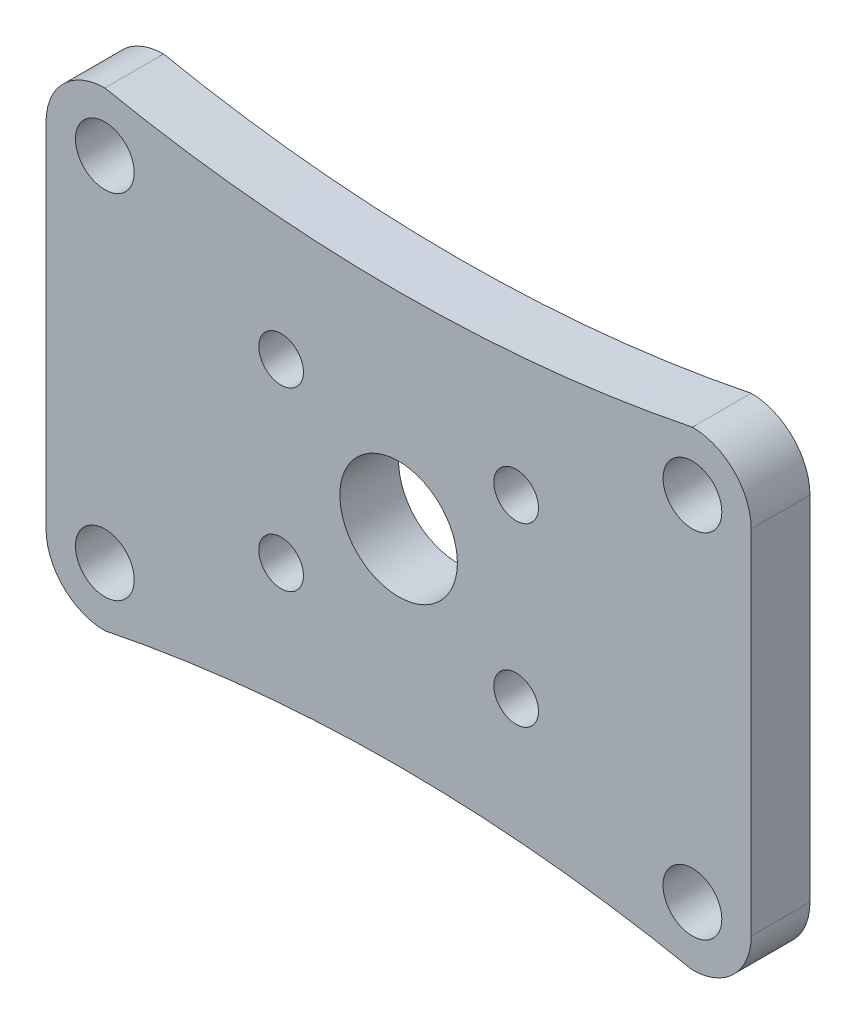
ISO-10303-21;
HEADER;
FILE_DESCRIPTION(('STEP AP214'),'2;1');
FILE_NAME('part.step','',(''),(''),'','','');
FILE_SCHEMA(('AUTOMOTIVE_DESIGN { 1 0 10303 214 1 1 1 1 }'));
ENDSEC;
DATA;
#1=APPLICATION_CONTEXT('core data for automotive mechanical design processes');
#2=APPLICATION_PROTOCOL_DEFINITION('international standard','automotive_design',2000,#1);
#3=PRODUCT_CONTEXT('',#1,'mechanical');
#4=PRODUCT('Part','Part','',(#3));
#5=PRODUCT_RELATED_PRODUCT_CATEGORY('part','',(#4));
#6=PRODUCT_DEFINITION_FORMATION('','',#4);
#7=PRODUCT_DEFINITION_CONTEXT('part definition',#1,'design');
#8=PRODUCT_DEFINITION('design','',#6,#7);
#9=PRODUCT_DEFINITION_SHAPE('','',#8);
#10=(LENGTH_UNIT() NAMED_UNIT(*) SI_UNIT(.MILLI.,.METRE.));
#11=(NAMED_UNIT(*) PLANE_ANGLE_UNIT() SI_UNIT($,.RADIAN.));
#12=(NAMED_UNIT(*) SI_UNIT($,.STERADIAN.) SOLID_ANGLE_UNIT());
#13=UNCERTAINTY_MEASURE_WITH_UNIT(LENGTH_MEASURE(1.E-05),#10,'distance_accuracy_value','');
#14=(GEOMETRIC_REPRESENTATION_CONTEXT(3) GLOBAL_UNCERTAINTY_ASSIGNED_CONTEXT((#13)) GLOBAL_UNIT_ASSIGNED_CONTEXT((#10,
#11,#12)) REPRESENTATION_CONTEXT('',''));
#15=CARTESIAN_POINT('',(0.,0.,0.));
#16=DIRECTION('',(0.,0.,1.));
#17=DIRECTION('',(1.,0.,0.));
#18=AXIS2_PLACEMENT_3D('',#15,#16,#17);
#19=CARTESIAN_POINT('',(-382.439077680824,181.19058585857,6.35));
#20=DIRECTION('',(0.,0.,1.));
#21=DIRECTION('',(1.,0.,0.));
#22=AXIS2_PLACEMENT_3D('',#19,#20,#21);
#23=PLANE('',#22);
#24=CARTESIAN_POINT('',(-363.389077680833,171.66558585857,6.35));
#25=DIRECTION('',(0.,0.,1.));
#26=DIRECTION('',(1.,0.,0.));
#27=AXIS2_PLACEMENT_3D('',#24,#25,#26);
#28=CIRCLE('',#27,2.413);
#29=CARTESIAN_POINT('',(-360.976077680833,171.66558585857,6.35));
#30=VERTEX_POINT('',#29);
#31=EDGE_CURVE('E227',#30,#30,#28,.T.);
#32=ORIENTED_EDGE('',*,*,#31,.F.);
#33=EDGE_LOOP('',(#32));
#34=FACE_BOUND('',#33,.T.);
#35=CARTESIAN_POINT('',(-363.389077680833,152.61558585857,6.35));
#36=DIRECTION('',(0.,0.,1.));
#37=DIRECTION('',(1.,0.,0.));
#38=AXIS2_PLACEMENT_3D('',#35,#36,#37);
#39=CIRCLE('',#38,2.413);
#40=CARTESIAN_POINT('',(-360.976077680833,152.61558585857,6.35));
#41=VERTEX_POINT('',#40);
#42=EDGE_CURVE('E221',#41,#41,#39,.T.);
#43=ORIENTED_EDGE('',*,*,#42,.F.);
#44=EDGE_LOOP('',(#43));
#45=FACE_BOUND('',#44,.T.);
#46=CARTESIAN_POINT('',(-337.989077680833,152.61558585857,6.35));
#47=DIRECTION('',(0.,0.,1.));
#48=DIRECTION('',(1.,0.,0.));
#49=AXIS2_PLACEMENT_3D('',#46,#47,#48);
#50=CIRCLE('',#49,2.413);
#51=CARTESIAN_POINT('',(-335.576077680833,152.61558585857,6.35));
#52=VERTEX_POINT('',#51);
#53=EDGE_CURVE('E215',#52,#52,#50,.T.);
#54=ORIENTED_EDGE('',*,*,#53,.F.);
#55=EDGE_LOOP('',(#54));
#56=FACE_BOUND('',#55,.T.);
#57=CARTESIAN_POINT('',(-337.989077680833,171.66558585857,6.35));
#58=DIRECTION('',(0.,0.,1.));
#59=DIRECTION('',(1.,0.,0.));
#60=AXIS2_PLACEMENT_3D('',#57,#58,#59);
#61=CIRCLE('',#60,2.413);
#62=CARTESIAN_POINT('',(-335.576077680833,171.66558585857,6.35));
#63=VERTEX_POINT('',#62);
#64=EDGE_CURVE('E209',#63,#63,#61,.T.);
#65=ORIENTED_EDGE('',*,*,#64,.F.);
#66=EDGE_LOOP('',(#65));
#67=FACE_BOUND('',#66,.T.);
#68=CARTESIAN_POINT('',(-350.689077680833,162.14058585857,6.35));
#69=DIRECTION('',(0.,0.,1.));
#70=DIRECTION('',(1.,0.,0.));
#71=AXIS2_PLACEMENT_3D('',#68,#69,#70);
#72=CIRCLE('',#71,6.34999999999999);
#73=CARTESIAN_POINT('',(-344.339077680833,162.14058585857,6.35));
#74=VERTEX_POINT('',#73);
#75=EDGE_CURVE('E203',#74,#74,#72,.T.);
#76=ORIENTED_EDGE('',*,*,#75,.F.);
#77=EDGE_LOOP('',(#76));
#78=FACE_BOUND('',#77,.T.);
#79=CARTESIAN_POINT('',(-382.439077680824,143.09058585857,6.35));
#80=DIRECTION('',(0.,0.,1.));
#81=DIRECTION('',(1.,0.,0.));
#82=AXIS2_PLACEMENT_3D('',#79,#80,#81);
#83=CIRCLE('',#82,3.17500000000002);
#84=CARTESIAN_POINT('',(-379.264077680824,143.09058585857,6.35));
#85=VERTEX_POINT('',#84);
#86=EDGE_CURVE('E188',#85,#85,#83,.T.);
#87=ORIENTED_EDGE('',*,*,#86,.F.);
#88=EDGE_LOOP('',(#87));
#89=FACE_BOUND('',#88,.T.);
#90=CARTESIAN_POINT('',(-382.439077680824,181.19058585857,6.35));
#91=DIRECTION('',(0.,0.,1.));
#92=DIRECTION('',(1.,0.,0.));
#93=AXIS2_PLACEMENT_3D('',#90,#91,#92);
#94=CIRCLE('',#93,3.17500000000002);
#95=CARTESIAN_POINT('',(-379.264077680824,181.19058585857,6.35));
#96=VERTEX_POINT('',#95);
#97=EDGE_CURVE('E134',#96,#96,#94,.T.);
#98=ORIENTED_EDGE('',*,*,#97,.F.);
#99=EDGE_LOOP('',(#98));
#100=FACE_BOUND('',#99,.T.);
#101=CARTESIAN_POINT('',(-382.439077680824,181.19058585857,6.35));
#102=DIRECTION('',(0.,0.,1.));
#103=DIRECTION('',(1.,0.,0.));
#104=AXIS2_PLACEMENT_3D('',#101,#102,#103);
#105=CIRCLE('',#104,6.34999999999998);
#106=CARTESIAN_POINT('',(-382.439077680824,187.54058585857,6.35));
#107=VERTEX_POINT('',#106);
#108=CARTESIAN_POINT('',(-388.789077680824,181.19058585857,6.35));
#109=VERTEX_POINT('',#108);
#110=EDGE_CURVE('E145',#107,#109,#105,.T.);
#111=ORIENTED_EDGE('',*,*,#110,.T.);
#112=DIRECTION('',(0.,-1.,0.));
#113=VECTOR('',#112,1.);
#114=CARTESIAN_POINT('',(-388.789077680824,181.19058585857,6.35));
#115=LINE('',#114,#113);
#116=CARTESIAN_POINT('',(-388.789077680824,143.09058585857,6.35));
#117=VERTEX_POINT('',#116);
#118=EDGE_CURVE('E93',#109,#117,#115,.T.);
#119=ORIENTED_EDGE('',*,*,#118,.T.);
#120=CARTESIAN_POINT('',(-382.439077680824,143.09058585857,6.35));
#121=DIRECTION('',(0.,0.,1.));
#122=DIRECTION('',(1.,0.,0.));
#123=AXIS2_PLACEMENT_3D('',#120,#121,#122);
#124=CIRCLE('',#123,6.34999999999999);
#125=CARTESIAN_POINT('',(-382.439077680824,136.74058585857,6.35));
#126=VERTEX_POINT('',#125);
#127=EDGE_CURVE('E160',#117,#126,#124,.T.);
#128=ORIENTED_EDGE('',*,*,#127,.T.);
#129=CARTESIAN_POINT('',(-350.689077680842,-18.9827898745733,6.35));
#130=DIRECTION('',(0.,0.,-1.));
#131=DIRECTION('',(-1.,0.,0.));
#132=AXIS2_PLACEMENT_3D('',#129,#130,#131);
#133=CIRCLE('',#132,158.927128740579);
#134=CARTESIAN_POINT('',(-318.939077680842,136.740585858566,6.35));
#135=VERTEX_POINT('',#134);
#136=EDGE_CURVE('E173',#126,#135,#133,.T.);
#137=ORIENTED_EDGE('',*,*,#136,.T.);
#138=CARTESIAN_POINT('',(-318.939077680842,143.090585858566,6.35));
#139=DIRECTION('',(0.,0.,1.));
#140=DIRECTION('',(1.,0.,0.));
#141=AXIS2_PLACEMENT_3D('',#138,#139,#140);
#142=CIRCLE('',#141,6.34999999999998);
#143=CARTESIAN_POINT('',(-312.589077680842,143.090585858566,6.35));
#144=VERTEX_POINT('',#143);
#145=EDGE_CURVE('E112',#135,#144,#142,.T.);
#146=ORIENTED_EDGE('',*,*,#145,.T.);
#147=DIRECTION('',(0.,1.,0.));
#148=VECTOR('',#147,1.);
#149=CARTESIAN_POINT('',(-312.589077680842,181.190585858574,6.35));
#150=LINE('',#149,#148);
#151=CARTESIAN_POINT('',(-312.589077680842,181.190585858574,6.35));
#152=VERTEX_POINT('',#151);
#153=EDGE_CURVE('E106',#144,#152,#150,.T.);
#154=ORIENTED_EDGE('',*,*,#153,.T.);
#155=CARTESIAN_POINT('',(-318.939077680842,181.190585858574,6.35));
#156=DIRECTION('',(0.,0.,1.));
#157=DIRECTION('',(1.,0.,0.));
#158=AXIS2_PLACEMENT_3D('',#155,#156,#157);
#159=CIRCLE('',#158,6.35000000000001);
#160=CARTESIAN_POINT('',(-318.939077680842,187.540585858574,6.35));
#161=VERTEX_POINT('',#160);
#162=EDGE_CURVE('E110',#152,#161,#159,.T.);
#163=ORIENTED_EDGE('',*,*,#162,.T.);
#164=CARTESIAN_POINT('',(-350.689077680842,343.263961591714,6.35));
#165=DIRECTION('',(0.,0.,-1.));
#166=DIRECTION('',(1.,0.,0.));
#167=AXIS2_PLACEMENT_3D('',#164,#165,#166);
#168=CIRCLE('',#167,158.927128740579);
#169=EDGE_CURVE('E50',#161,#107,#168,.T.);
#170=ORIENTED_EDGE('',*,*,#169,.T.);
#171=EDGE_LOOP('',(#111,#119,#128,#137,#146,#154,#163,#170));
#172=FACE_BOUND('',#171,.T.);
#173=CARTESIAN_POINT('',(-318.939077680842,181.190585858574,6.35));
#174=DIRECTION('',(0.,0.,1.));
#175=DIRECTION('',(1.,0.,0.));
#176=AXIS2_PLACEMENT_3D('',#173,#174,#175);
#177=CIRCLE('',#176,3.1750000000162);
#178=CARTESIAN_POINT('',(-315.764077680825,181.190585858574,6.35));
#179=VERTEX_POINT('',#178);
#180=EDGE_CURVE('E182',#179,#179,#177,.T.);
#181=ORIENTED_EDGE('',*,*,#180,.F.);
#182=EDGE_LOOP('',(#181));
#183=FACE_BOUND('',#182,.T.);
#184=CARTESIAN_POINT('',(-318.939077680842,143.090585858566,6.35));
#185=DIRECTION('',(0.,0.,1.));
#186=DIRECTION('',(1.,0.,0.));
#187=AXIS2_PLACEMENT_3D('',#184,#185,#186);
#188=CIRCLE('',#187,3.17500000001831);
#189=CARTESIAN_POINT('',(-315.764077680823,143.090585858566,6.35));
#190=VERTEX_POINT('',#189);
#191=EDGE_CURVE('E194',#190,#190,#188,.T.);
#192=ORIENTED_EDGE('',*,*,#191,.F.);
#193=EDGE_LOOP('',(#192));
#194=FACE_BOUND('',#193,.T.);
#195=ADVANCED_FACE('F33',(#34,#45,#56,#67,#78,#89,#100,#172,#183,#194),#23,.T.);
#196=CARTESIAN_POINT('',(-382.439077680824,181.19058585857,0.));
#197=DIRECTION('',(0.,0.,1.));
#198=DIRECTION('',(1.,0.,0.));
#199=AXIS2_PLACEMENT_3D('',#196,#197,#198);
#200=PLANE('',#199);
#201=CARTESIAN_POINT('',(-363.389077680833,171.66558585857,0.));
#202=DIRECTION('',(0.,0.,1.));
#203=DIRECTION('',(1.,0.,0.));
#204=AXIS2_PLACEMENT_3D('',#201,#202,#203);
#205=CIRCLE('',#204,2.413);
#206=CARTESIAN_POINT('',(-360.976077680833,171.66558585857,0.));
#207=VERTEX_POINT('',#206);
#208=EDGE_CURVE('E224',#207,#207,#205,.T.);
#209=ORIENTED_EDGE('',*,*,#208,.T.);
#210=EDGE_LOOP('',(#209));
#211=FACE_BOUND('',#210,.T.);
#212=CARTESIAN_POINT('',(-363.389077680833,152.61558585857,0.));
#213=DIRECTION('',(0.,0.,1.));
#214=DIRECTION('',(1.,0.,0.));
#215=AXIS2_PLACEMENT_3D('',#212,#213,#214);
#216=CIRCLE('',#215,2.413);
#217=CARTESIAN_POINT('',(-360.976077680833,152.61558585857,0.));
#218=VERTEX_POINT('',#217);
#219=EDGE_CURVE('E218',#218,#218,#216,.T.);
#220=ORIENTED_EDGE('',*,*,#219,.T.);
#221=EDGE_LOOP('',(#220));
#222=FACE_BOUND('',#221,.T.);
#223=CARTESIAN_POINT('',(-337.989077680833,152.61558585857,0.));
#224=DIRECTION('',(0.,0.,1.));
#225=DIRECTION('',(1.,0.,0.));
#226=AXIS2_PLACEMENT_3D('',#223,#224,#225);
#227=CIRCLE('',#226,2.413);
#228=CARTESIAN_POINT('',(-335.576077680833,152.61558585857,0.));
#229=VERTEX_POINT('',#228);
#230=EDGE_CURVE('E212',#229,#229,#227,.T.);
#231=ORIENTED_EDGE('',*,*,#230,.T.);
#232=EDGE_LOOP('',(#231));
#233=FACE_BOUND('',#232,.T.);
#234=CARTESIAN_POINT('',(-337.989077680833,171.66558585857,0.));
#235=DIRECTION('',(0.,0.,1.));
#236=DIRECTION('',(1.,0.,0.));
#237=AXIS2_PLACEMENT_3D('',#234,#235,#236);
#238=CIRCLE('',#237,2.413);
#239=CARTESIAN_POINT('',(-335.576077680833,171.66558585857,0.));
#240=VERTEX_POINT('',#239);
#241=EDGE_CURVE('E206',#240,#240,#238,.T.);
#242=ORIENTED_EDGE('',*,*,#241,.T.);
#243=EDGE_LOOP('',(#242));
#244=FACE_BOUND('',#243,.T.);
#245=CARTESIAN_POINT('',(-350.689077680833,162.14058585857,0.));
#246=DIRECTION('',(0.,0.,1.));
#247=DIRECTION('',(1.,0.,0.));
#248=AXIS2_PLACEMENT_3D('',#245,#246,#247);
#249=CIRCLE('',#248,6.34999999999999);
#250=CARTESIAN_POINT('',(-344.339077680833,162.14058585857,0.));
#251=VERTEX_POINT('',#250);
#252=EDGE_CURVE('E200',#251,#251,#249,.T.);
#253=ORIENTED_EDGE('',*,*,#252,.T.);
#254=EDGE_LOOP('',(#253));
#255=FACE_BOUND('',#254,.T.);
#256=CARTESIAN_POINT('',(-382.439077680824,143.09058585857,0.));
#257=DIRECTION('',(0.,0.,1.));
#258=DIRECTION('',(1.,0.,0.));
#259=AXIS2_PLACEMENT_3D('',#256,#257,#258);
#260=CIRCLE('',#259,3.17500000000002);
#261=CARTESIAN_POINT('',(-379.264077680824,143.09058585857,0.));
#262=VERTEX_POINT('',#261);
#263=EDGE_CURVE('E191',#262,#262,#260,.T.);
#264=ORIENTED_EDGE('',*,*,#263,.T.);
#265=EDGE_LOOP('',(#264));
#266=FACE_BOUND('',#265,.T.);
#267=CARTESIAN_POINT('',(-382.439077680824,181.19058585857,0.));
#268=DIRECTION('',(0.,0.,1.));
#269=DIRECTION('',(1.,0.,0.));
#270=AXIS2_PLACEMENT_3D('',#267,#268,#269);
#271=CIRCLE('',#270,3.17500000000002);
#272=CARTESIAN_POINT('',(-379.264077680824,181.19058585857,0.));
#273=VERTEX_POINT('',#272);
#274=EDGE_CURVE('E179',#273,#273,#271,.T.);
#275=ORIENTED_EDGE('',*,*,#274,.T.);
#276=EDGE_LOOP('',(#275));
#277=FACE_BOUND('',#276,.T.);
#278=CARTESIAN_POINT('',(-382.439077680824,181.19058585857,0.));
#279=DIRECTION('',(0.,0.,1.));
#280=DIRECTION('',(1.,0.,0.));
#281=AXIS2_PLACEMENT_3D('',#278,#279,#280);
#282=CIRCLE('',#281,6.34999999999998);
#283=CARTESIAN_POINT('',(-382.439077680824,187.54058585857,0.));
#284=VERTEX_POINT('',#283);
#285=CARTESIAN_POINT('',(-388.789077680824,181.19058585857,0.));
#286=VERTEX_POINT('',#285);
#287=EDGE_CURVE('E130',#284,#286,#282,.T.);
#288=ORIENTED_EDGE('',*,*,#287,.F.);
#289=CARTESIAN_POINT('',(-350.689077680842,343.263961591714,0.));
#290=DIRECTION('',(0.,0.,-1.));
#291=DIRECTION('',(1.,0.,0.));
#292=AXIS2_PLACEMENT_3D('',#289,#290,#291);
#293=CIRCLE('',#292,158.927128740579);
#294=CARTESIAN_POINT('',(-318.939077680842,187.540585858574,0.));
#295=VERTEX_POINT('',#294);
#296=EDGE_CURVE('E85',#295,#284,#293,.T.);
#297=ORIENTED_EDGE('',*,*,#296,.F.);
#298=CARTESIAN_POINT('',(-318.939077680842,181.190585858574,0.));
#299=DIRECTION('',(0.,0.,1.));
#300=DIRECTION('',(1.,0.,0.));
#301=AXIS2_PLACEMENT_3D('',#298,#299,#300);
#302=CIRCLE('',#301,6.35000000000001);
#303=CARTESIAN_POINT('',(-312.589077680842,181.190585858574,0.));
#304=VERTEX_POINT('',#303);
#305=EDGE_CURVE('E79',#304,#295,#302,.T.);
#306=ORIENTED_EDGE('',*,*,#305,.F.);
#307=DIRECTION('',(0.,1.,0.));
#308=VECTOR('',#307,1.);
#309=CARTESIAN_POINT('',(-312.589077680842,181.190585858574,0.));
#310=LINE('',#309,#308);
#311=CARTESIAN_POINT('',(-312.589077680842,143.090585858566,0.));
#312=VERTEX_POINT('',#311);
#313=EDGE_CURVE('E120',#312,#304,#310,.T.);
#314=ORIENTED_EDGE('',*,*,#313,.F.);
#315=CARTESIAN_POINT('',(-318.939077680842,143.090585858566,0.));
#316=DIRECTION('',(0.,0.,1.));
#317=DIRECTION('',(1.,0.,0.));
#318=AXIS2_PLACEMENT_3D('',#315,#316,#317);
#319=CIRCLE('',#318,6.34999999999998);
#320=CARTESIAN_POINT('',(-318.939077680842,136.740585858566,0.));
#321=VERTEX_POINT('',#320);
#322=EDGE_CURVE('E140',#321,#312,#319,.T.);
#323=ORIENTED_EDGE('',*,*,#322,.F.);
#324=CARTESIAN_POINT('',(-350.689077680842,-18.9827898745733,0.));
#325=DIRECTION('',(0.,0.,-1.));
#326=DIRECTION('',(-1.,0.,0.));
#327=AXIS2_PLACEMENT_3D('',#324,#325,#326);
#328=CIRCLE('',#327,158.927128740579);
#329=CARTESIAN_POINT('',(-382.439077680824,136.74058585857,0.));
#330=VERTEX_POINT('',#329);
#331=EDGE_CURVE('E138',#330,#321,#328,.T.);
#332=ORIENTED_EDGE('',*,*,#331,.F.);
#333=CARTESIAN_POINT('',(-382.439077680824,143.09058585857,0.));
#334=DIRECTION('',(0.,0.,1.));
#335=DIRECTION('',(1.,0.,0.));
#336=AXIS2_PLACEMENT_3D('',#333,#334,#335);
#337=CIRCLE('',#336,6.34999999999999);
#338=CARTESIAN_POINT('',(-388.789077680824,143.09058585857,0.));
#339=VERTEX_POINT('',#338);
#340=EDGE_CURVE('E136',#339,#330,#337,.T.);
#341=ORIENTED_EDGE('',*,*,#340,.F.);
#342=DIRECTION('',(0.,-1.,0.));
#343=VECTOR('',#342,1.);
#344=CARTESIAN_POINT('',(-388.789077680824,181.19058585857,0.));
#345=LINE('',#344,#343);
#346=EDGE_CURVE('E133',#286,#339,#345,.T.);
#347=ORIENTED_EDGE('',*,*,#346,.F.);
#348=EDGE_LOOP('',(#288,#297,#306,#314,#323,#332,#341,#347));
#349=FACE_BOUND('',#348,.T.);
#350=CARTESIAN_POINT('',(-318.939077680842,181.190585858574,0.));
#351=DIRECTION('',(0.,0.,1.));
#352=DIRECTION('',(1.,0.,0.));
#353=AXIS2_PLACEMENT_3D('',#350,#351,#352);
#354=CIRCLE('',#353,3.1750000000162);
#355=CARTESIAN_POINT('',(-315.764077680825,181.190585858574,0.));
#356=VERTEX_POINT('',#355);
#357=EDGE_CURVE('E185',#356,#356,#354,.T.);
#358=ORIENTED_EDGE('',*,*,#357,.T.);
#359=EDGE_LOOP('',(#358));
#360=FACE_BOUND('',#359,.T.);
#361=CARTESIAN_POINT('',(-318.939077680842,143.090585858566,0.));
#362=DIRECTION('',(0.,0.,1.));
#363=DIRECTION('',(1.,0.,0.));
#364=AXIS2_PLACEMENT_3D('',#361,#362,#363);
#365=CIRCLE('',#364,3.17500000001831);
#366=CARTESIAN_POINT('',(-315.764077680823,143.090585858566,0.));
#367=VERTEX_POINT('',#366);
#368=EDGE_CURVE('E197',#367,#367,#365,.T.);
#369=ORIENTED_EDGE('',*,*,#368,.T.);
#370=EDGE_LOOP('',(#369));
#371=FACE_BOUND('',#370,.T.);
#372=ADVANCED_FACE('F164',(#211,#222,#233,#244,#255,#266,#277,#349,#360,#371),#200,.F.);
#373=CARTESIAN_POINT('',(-382.439077680824,181.19058585857,6.35));
#374=DIRECTION('',(0.,0.,-1.));
#375=DIRECTION('',(-1.,0.,0.));
#376=AXIS2_PLACEMENT_3D('',#373,#374,#375);
#377=CYLINDRICAL_SURFACE('',#376,6.34999999999998);
#378=ORIENTED_EDGE('',*,*,#287,.T.);
#379=DIRECTION('',(0.,0.,-1.));
#380=VECTOR('',#379,1.);
#381=CARTESIAN_POINT('',(-388.789077680824,181.19058585857,6.35));
#382=LINE('',#381,#380);
#383=EDGE_CURVE('E11',#109,#286,#382,.T.);
#384=ORIENTED_EDGE('',*,*,#383,.F.);
#385=ORIENTED_EDGE('',*,*,#110,.F.);
#386=DIRECTION('',(0.,0.,-1.));
#387=VECTOR('',#386,1.);
#388=CARTESIAN_POINT('',(-382.439077680824,187.54058585857,6.35));
#389=LINE('',#388,#387);
#390=EDGE_CURVE('E126',#107,#284,#389,.T.);
#391=ORIENTED_EDGE('',*,*,#390,.T.);
#392=EDGE_LOOP('',(#378,#384,#385,#391));
#393=FACE_BOUND('',#392,.T.);
#394=ADVANCED_FACE('F35',(#393),#377,.T.);
#395=CARTESIAN_POINT('',(-388.789077680824,181.19058585857,6.35));
#396=DIRECTION('',(1.,0.,0.));
#397=DIRECTION('',(0.,0.,-1.));
#398=AXIS2_PLACEMENT_3D('',#395,#396,#397);
#399=PLANE('',#398);
#400=ORIENTED_EDGE('',*,*,#346,.T.);
#401=DIRECTION('',(0.,0.,-1.));
#402=VECTOR('',#401,1.);
#403=CARTESIAN_POINT('',(-388.789077680824,143.09058585857,6.35));
#404=LINE('',#403,#402);
#405=EDGE_CURVE('E42',#117,#339,#404,.T.);
#406=ORIENTED_EDGE('',*,*,#405,.F.);
#407=ORIENTED_EDGE('',*,*,#118,.F.);
#408=ORIENTED_EDGE('',*,*,#383,.T.);
#409=EDGE_LOOP('',(#400,#406,#407,#408));
#410=FACE_BOUND('',#409,.T.);
#411=ADVANCED_FACE('F271',(#410),#399,.F.);
#412=CARTESIAN_POINT('',(-382.439077680824,143.09058585857,6.35));
#413=DIRECTION('',(0.,0.,-1.));
#414=DIRECTION('',(-1.,0.,0.));
#415=AXIS2_PLACEMENT_3D('',#412,#413,#414);
#416=CYLINDRICAL_SURFACE('',#415,6.34999999999999);
#417=ORIENTED_EDGE('',*,*,#340,.T.);
#418=DIRECTION('',(0.,0.,-1.));
#419=VECTOR('',#418,1.);
#420=CARTESIAN_POINT('',(-382.439077680824,136.74058585857,6.35));
#421=LINE('',#420,#419);
#422=EDGE_CURVE('E152',#126,#330,#421,.T.);
#423=ORIENTED_EDGE('',*,*,#422,.F.);
#424=ORIENTED_EDGE('',*,*,#127,.F.);
#425=ORIENTED_EDGE('',*,*,#405,.T.);
#426=EDGE_LOOP('',(#417,#423,#424,#425));
#427=FACE_BOUND('',#426,.T.);
#428=ADVANCED_FACE('F158',(#427),#416,.T.);
#429=CARTESIAN_POINT('',(-350.689077680842,-18.9827898745733,6.35));
#430=DIRECTION('',(0.,0.,-1.));
#431=DIRECTION('',(-1.,0.,0.));
#432=AXIS2_PLACEMENT_3D('',#429,#430,#431);
#433=CYLINDRICAL_SURFACE('',#432,158.927128740579);
#434=ORIENTED_EDGE('',*,*,#331,.T.);
#435=DIRECTION('',(0.,0.,-1.));
#436=VECTOR('',#435,1.);
#437=CARTESIAN_POINT('',(-318.939077680842,136.740585858566,6.35));
#438=LINE('',#437,#436);
#439=EDGE_CURVE('E149',#135,#321,#438,.T.);
#440=ORIENTED_EDGE('',*,*,#439,.F.);
#441=ORIENTED_EDGE('',*,*,#136,.F.);
#442=ORIENTED_EDGE('',*,*,#422,.T.);
#443=EDGE_LOOP('',(#434,#440,#441,#442));
#444=FACE_BOUND('',#443,.T.);
#445=ADVANCED_FACE('F169',(#444),#433,.F.);
#446=CARTESIAN_POINT('',(-318.939077680842,143.090585858566,6.35));
#447=DIRECTION('',(0.,0.,-1.));
#448=DIRECTION('',(-1.,0.,0.));
#449=AXIS2_PLACEMENT_3D('',#446,#447,#448);
#450=CYLINDRICAL_SURFACE('',#449,6.34999999999998);
#451=ORIENTED_EDGE('',*,*,#322,.T.);
#452=DIRECTION('',(0.,0.,-1.));
#453=VECTOR('',#452,1.);
#454=CARTESIAN_POINT('',(-312.589077680842,143.090585858566,6.35));
#455=LINE('',#454,#453);
#456=EDGE_CURVE('E121',#144,#312,#455,.T.);
#457=ORIENTED_EDGE('',*,*,#456,.F.);
#458=ORIENTED_EDGE('',*,*,#145,.F.);
#459=ORIENTED_EDGE('',*,*,#439,.T.);
#460=EDGE_LOOP('',(#451,#457,#458,#459));
#461=FACE_BOUND('',#460,.T.);
#462=ADVANCED_FACE('F172',(#461),#450,.T.);
#463=CARTESIAN_POINT('',(-312.589077680842,181.190585858574,6.35));
#464=DIRECTION('',(-1.,0.,0.));
#465=DIRECTION('',(0.,0.,1.));
#466=AXIS2_PLACEMENT_3D('',#463,#464,#465);
#467=PLANE('',#466);
#468=ORIENTED_EDGE('',*,*,#313,.T.);
#469=DIRECTION('',(0.,0.,-1.));
#470=VECTOR('',#469,1.);
#471=CARTESIAN_POINT('',(-312.589077680842,181.190585858574,6.35));
#472=LINE('',#471,#470);
#473=EDGE_CURVE('E117',#152,#304,#472,.T.);
#474=ORIENTED_EDGE('',*,*,#473,.F.);
#475=ORIENTED_EDGE('',*,*,#153,.F.);
#476=ORIENTED_EDGE('',*,*,#456,.T.);
#477=EDGE_LOOP('',(#468,#474,#475,#476));
#478=FACE_BOUND('',#477,.T.);
#479=ADVANCED_FACE('F118',(#478),#467,.F.);
#480=CARTESIAN_POINT('',(-318.939077680842,181.190585858574,6.35));
#481=DIRECTION('',(0.,0.,-1.));
#482=DIRECTION('',(-1.,0.,0.));
#483=AXIS2_PLACEMENT_3D('',#480,#481,#482);
#484=CYLINDRICAL_SURFACE('',#483,6.35000000000001);
#485=ORIENTED_EDGE('',*,*,#305,.T.);
#486=DIRECTION('',(0.,0.,-1.));
#487=VECTOR('',#486,1.);
#488=CARTESIAN_POINT('',(-318.939077680842,187.540585858574,6.35));
#489=LINE('',#488,#487);
#490=EDGE_CURVE('E122',#161,#295,#489,.T.);
#491=ORIENTED_EDGE('',*,*,#490,.F.);
#492=ORIENTED_EDGE('',*,*,#162,.F.);
#493=ORIENTED_EDGE('',*,*,#473,.T.);
#494=EDGE_LOOP('',(#485,#491,#492,#493));
#495=FACE_BOUND('',#494,.T.);
#496=ADVANCED_FACE('F124',(#495),#484,.T.);
#497=CARTESIAN_POINT('',(-350.689077680842,343.263961591714,6.35));
#498=DIRECTION('',(0.,0.,-1.));
#499=DIRECTION('',(-1.,0.,0.));
#500=AXIS2_PLACEMENT_3D('',#497,#498,#499);
#501=CYLINDRICAL_SURFACE('',#500,158.927128740579);
#502=ORIENTED_EDGE('',*,*,#296,.T.);
#503=ORIENTED_EDGE('',*,*,#390,.F.);
#504=ORIENTED_EDGE('',*,*,#169,.F.);
#505=ORIENTED_EDGE('',*,*,#490,.T.);
#506=EDGE_LOOP('',(#502,#503,#504,#505));
#507=FACE_BOUND('',#506,.T.);
#508=ADVANCED_FACE('F261',(#507),#501,.F.);
#509=CARTESIAN_POINT('',(-382.439077680824,181.19058585857,6.35));
#510=DIRECTION('',(0.,0.,-1.));
#511=DIRECTION('',(-1.,0.,0.));
#512=AXIS2_PLACEMENT_3D('',#509,#510,#511);
#513=CYLINDRICAL_SURFACE('',#512,3.17500000000002);
#514=ORIENTED_EDGE('',*,*,#97,.T.);
#515=EDGE_LOOP('',(#514));
#516=FACE_BOUND('',#515,.T.);
#517=ORIENTED_EDGE('',*,*,#274,.F.);
#518=EDGE_LOOP('',(#517));
#519=FACE_BOUND('',#518,.T.);
#520=ADVANCED_FACE('F257',(#516,#519),#513,.F.);
#521=CARTESIAN_POINT('',(-318.939077680842,181.190585858574,6.35));
#522=DIRECTION('',(0.,0.,-1.));
#523=DIRECTION('',(-1.,0.,0.));
#524=AXIS2_PLACEMENT_3D('',#521,#522,#523);
#525=CYLINDRICAL_SURFACE('',#524,3.1750000000162);
#526=ORIENTED_EDGE('',*,*,#180,.T.);
#527=EDGE_LOOP('',(#526));
#528=FACE_BOUND('',#527,.T.);
#529=ORIENTED_EDGE('',*,*,#357,.F.);
#530=EDGE_LOOP('',(#529));
#531=FACE_BOUND('',#530,.T.);
#532=ADVANCED_FACE('F260',(#528,#531),#525,.F.);
#533=CARTESIAN_POINT('',(-382.439077680824,143.09058585857,6.35));
#534=DIRECTION('',(0.,0.,-1.));
#535=DIRECTION('',(-1.,0.,0.));
#536=AXIS2_PLACEMENT_3D('',#533,#534,#535);
#537=CYLINDRICAL_SURFACE('',#536,3.17500000000002);
#538=ORIENTED_EDGE('',*,*,#86,.T.);
#539=EDGE_LOOP('',(#538));
#540=FACE_BOUND('',#539,.T.);
#541=ORIENTED_EDGE('',*,*,#263,.F.);
#542=EDGE_LOOP('',(#541));
#543=FACE_BOUND('',#542,.T.);
#544=ADVANCED_FACE('F326',(#540,#543),#537,.F.);
#545=CARTESIAN_POINT('',(-318.939077680842,143.090585858566,6.35));
#546=DIRECTION('',(0.,0.,-1.));
#547=DIRECTION('',(-1.,0.,0.));
#548=AXIS2_PLACEMENT_3D('',#545,#546,#547);
#549=CYLINDRICAL_SURFACE('',#548,3.17500000001831);
#550=ORIENTED_EDGE('',*,*,#191,.T.);
#551=EDGE_LOOP('',(#550));
#552=FACE_BOUND('',#551,.T.);
#553=ORIENTED_EDGE('',*,*,#368,.F.);
#554=EDGE_LOOP('',(#553));
#555=FACE_BOUND('',#554,.T.);
#556=ADVANCED_FACE('F334',(#552,#555),#549,.F.);
#557=CARTESIAN_POINT('',(-350.689077680833,162.14058585857,0.));
#558=DIRECTION('',(0.,0.,1.));
#559=DIRECTION('',(1.,0.,0.));
#560=AXIS2_PLACEMENT_3D('',#557,#558,#559);
#561=CYLINDRICAL_SURFACE('',#560,6.34999999999999);
#562=ORIENTED_EDGE('',*,*,#252,.F.);
#563=EDGE_LOOP('',(#562));
#564=FACE_BOUND('',#563,.T.);
#565=ORIENTED_EDGE('',*,*,#75,.T.);
#566=EDGE_LOOP('',(#565));
#567=FACE_BOUND('',#566,.T.);
#568=ADVANCED_FACE('F342',(#564,#567),#561,.F.);
#569=CARTESIAN_POINT('',(-337.989077680833,171.66558585857,0.));
#570=DIRECTION('',(0.,0.,1.));
#571=DIRECTION('',(1.,0.,0.));
#572=AXIS2_PLACEMENT_3D('',#569,#570,#571);
#573=CYLINDRICAL_SURFACE('',#572,2.413);
#574=ORIENTED_EDGE('',*,*,#241,.F.);
#575=EDGE_LOOP('',(#574));
#576=FACE_BOUND('',#575,.T.);
#577=ORIENTED_EDGE('',*,*,#64,.T.);
#578=EDGE_LOOP('',(#577));
#579=FACE_BOUND('',#578,.T.);
#580=ADVANCED_FACE('F350',(#576,#579),#573,.F.);
#581=CARTESIAN_POINT('',(-337.989077680833,152.61558585857,0.));
#582=DIRECTION('',(0.,0.,1.));
#583=DIRECTION('',(1.,0.,0.));
#584=AXIS2_PLACEMENT_3D('',#581,#582,#583);
#585=CYLINDRICAL_SURFACE('',#584,2.413);
#586=ORIENTED_EDGE('',*,*,#230,.F.);
#587=EDGE_LOOP('',(#586));
#588=FACE_BOUND('',#587,.T.);
#589=ORIENTED_EDGE('',*,*,#53,.T.);
#590=EDGE_LOOP('',(#589));
#591=FACE_BOUND('',#590,.T.);
#592=ADVANCED_FACE('F357',(#588,#591),#585,.F.);
#593=CARTESIAN_POINT('',(-363.389077680833,152.61558585857,0.));
#594=DIRECTION('',(0.,0.,1.));
#595=DIRECTION('',(1.,0.,0.));
#596=AXIS2_PLACEMENT_3D('',#593,#594,#595);
#597=CYLINDRICAL_SURFACE('',#596,2.413);
#598=ORIENTED_EDGE('',*,*,#219,.F.);
#599=EDGE_LOOP('',(#598));
#600=FACE_BOUND('',#599,.T.);
#601=ORIENTED_EDGE('',*,*,#42,.T.);
#602=EDGE_LOOP('',(#601));
#603=FACE_BOUND('',#602,.T.);
#604=ADVANCED_FACE('F238',(#600,#603),#597,.F.);
#605=CARTESIAN_POINT('',(-363.389077680833,171.66558585857,0.));
#606=DIRECTION('',(0.,0.,1.));
#607=DIRECTION('',(1.,0.,0.));
#608=AXIS2_PLACEMENT_3D('',#605,#606,#607);
#609=CYLINDRICAL_SURFACE('',#608,2.413);
#610=ORIENTED_EDGE('',*,*,#208,.F.);
#611=EDGE_LOOP('',(#610));
#612=FACE_BOUND('',#611,.T.);
#613=ORIENTED_EDGE('',*,*,#31,.T.);
#614=EDGE_LOOP('',(#613));
#615=FACE_BOUND('',#614,.T.);
#616=ADVANCED_FACE('F235',(#612,#615),#609,.F.);
#617=CLOSED_SHELL('',(#195,#372,#394,#411,#428,#445,#462,#479,#496,#508,#520,#532,#544,#556,
#568,#580,#592,#604,#616));
#618=MANIFOLD_SOLID_BREP('B2',#617);
#619=ADVANCED_BREP_SHAPE_REPRESENTATION('',(#18,#618),#14);
#620=SHAPE_DEFINITION_REPRESENTATION(#9,#619);
ENDSEC;
END-ISO-10303-21;
